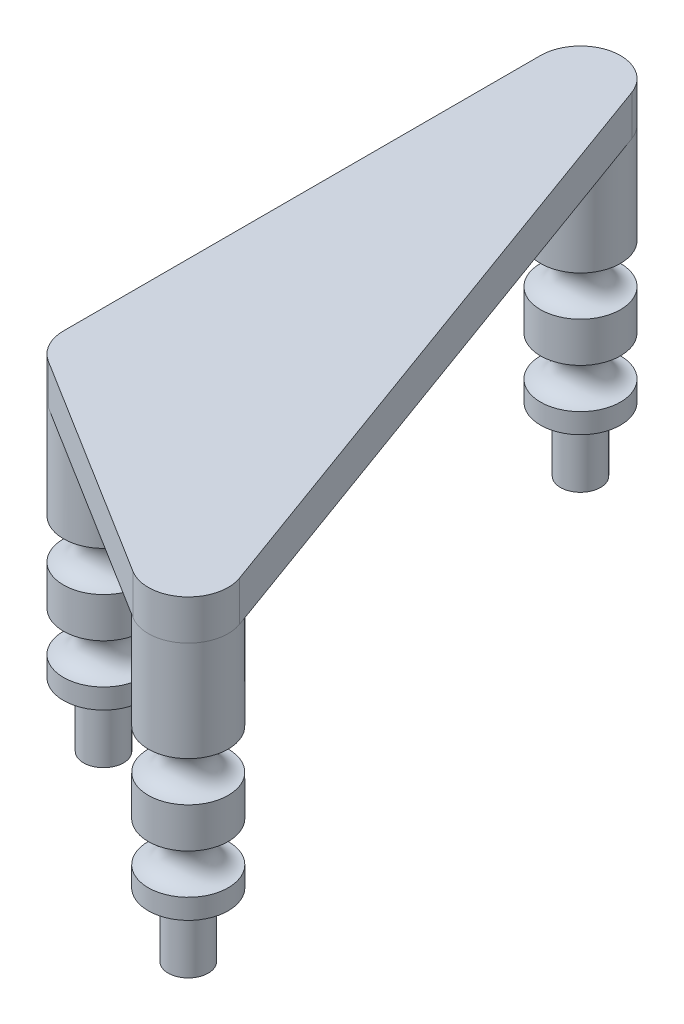
ISO-10303-21;
HEADER;
FILE_DESCRIPTION(('STEP AP214'),'2;1');
FILE_NAME('part.step','',(''),(''),'','','');
FILE_SCHEMA(('AUTOMOTIVE_DESIGN { 1 0 10303 214 1 1 1 1 }'));
ENDSEC;
DATA;
#1=APPLICATION_CONTEXT('core data for automotive mechanical design processes');
#2=APPLICATION_PROTOCOL_DEFINITION('international standard','automotive_design',2000,#1);
#3=PRODUCT_CONTEXT('',#1,'mechanical');
#4=PRODUCT('Part','Part','',(#3));
#5=PRODUCT_RELATED_PRODUCT_CATEGORY('part','',(#4));
#6=PRODUCT_DEFINITION_FORMATION('','',#4);
#7=PRODUCT_DEFINITION_CONTEXT('part definition',#1,'design');
#8=PRODUCT_DEFINITION('design','',#6,#7);
#9=PRODUCT_DEFINITION_SHAPE('','',#8);
#10=(LENGTH_UNIT() NAMED_UNIT(*) SI_UNIT(.MILLI.,.METRE.));
#11=(NAMED_UNIT(*) PLANE_ANGLE_UNIT() SI_UNIT($,.RADIAN.));
#12=(NAMED_UNIT(*) SI_UNIT($,.STERADIAN.) SOLID_ANGLE_UNIT());
#13=UNCERTAINTY_MEASURE_WITH_UNIT(LENGTH_MEASURE(1.E-05),#10,'distance_accuracy_value','');
#14=(GEOMETRIC_REPRESENTATION_CONTEXT(3) GLOBAL_UNCERTAINTY_ASSIGNED_CONTEXT((#13)) GLOBAL_UNIT_ASSIGNED_CONTEXT((#10,
#11,#12)) REPRESENTATION_CONTEXT('',''));
#15=CARTESIAN_POINT('',(0.,0.,0.));
#16=DIRECTION('',(0.,0.,1.));
#17=DIRECTION('',(1.,0.,0.));
#18=AXIS2_PLACEMENT_3D('',#15,#16,#17);
#19=CARTESIAN_POINT('',(0.,-38.1,-75.68438));
#20=DIRECTION('',(0.,1.,0.));
#21=DIRECTION('',(0.,0.,1.));
#22=AXIS2_PLACEMENT_3D('',#19,#20,#21);
#23=CYLINDRICAL_SURFACE('',#22,6.35);
#24=CARTESIAN_POINT('',(0.,0.,-75.68438));
#25=DIRECTION('',(0.,1.,0.));
#26=DIRECTION('',(0.,0.,1.));
#27=AXIS2_PLACEMENT_3D('',#24,#25,#26);
#28=CIRCLE('',#27,6.35);
#29=CARTESIAN_POINT('',(5.96704814199053,0.,-77.856207910118));
#30=VERTEX_POINT('',#29);
#31=CARTESIAN_POINT('',(-6.35,0.,-75.68438));
#32=VERTEX_POINT('',#31);
#33=EDGE_CURVE('E360',#30,#32,#28,.T.);
#34=ORIENTED_EDGE('',*,*,#33,.F.);
#35=EDGE_CURVE('E247',#32,#30,#28,.T.);
#36=ORIENTED_EDGE('',*,*,#35,.F.);
#37=EDGE_LOOP('',(#34,#36));
#38=FACE_BOUND('',#37,.T.);
#39=CARTESIAN_POINT('',(0.,-15.875,-75.68438));
#40=DIRECTION('',(0.,-1.,0.));
#41=DIRECTION('',(0.,0.,-1.));
#42=AXIS2_PLACEMENT_3D('',#39,#40,#41);
#43=CIRCLE('',#42,6.35);
#44=CARTESIAN_POINT('',(0.,-15.875,-82.03438));
#45=VERTEX_POINT('',#44);
#46=EDGE_CURVE('E304',#45,#45,#43,.F.);
#47=ORIENTED_EDGE('',*,*,#46,.T.);
#48=EDGE_LOOP('',(#47));
#49=FACE_BOUND('',#48,.T.);
#50=ADVANCED_FACE('F181',(#38,#49),#23,.T.);
#51=CARTESIAN_POINT('',(0.,6.35,0.));
#52=DIRECTION('',(0.,-1.,0.));
#53=DIRECTION('',(0.,0.,-1.));
#54=AXIS2_PLACEMENT_3D('',#51,#52,#53);
#55=CYLINDRICAL_SURFACE('',#54,6.35);
#56=CARTESIAN_POINT('',(0.,6.35,0.));
#57=DIRECTION('',(0.,1.,0.));
#58=DIRECTION('',(0.,0.,1.));
#59=AXIS2_PLACEMENT_3D('',#56,#57,#58);
#60=CIRCLE('',#59,6.35);
#61=CARTESIAN_POINT('',(-6.35,6.35,0.));
#62=VERTEX_POINT('',#61);
#63=CARTESIAN_POINT('',(-3.35600824597808,6.35,5.39070576575342));
#64=VERTEX_POINT('',#63);
#65=EDGE_CURVE('E359',#62,#64,#60,.T.);
#66=ORIENTED_EDGE('',*,*,#65,.F.);
#67=DIRECTION('',(0.,-1.,0.));
#68=VECTOR('',#67,1.);
#69=CARTESIAN_POINT('',(-6.35,6.35,0.));
#70=LINE('',#69,#68);
#71=CARTESIAN_POINT('',(-6.35,0.,0.));
#72=VERTEX_POINT('',#71);
#73=EDGE_CURVE('E379',#62,#72,#70,.T.);
#74=ORIENTED_EDGE('',*,*,#73,.T.);
#75=CARTESIAN_POINT('',(0.,0.,0.));
#76=DIRECTION('',(0.,1.,0.));
#77=DIRECTION('',(0.,0.,1.));
#78=AXIS2_PLACEMENT_3D('',#75,#76,#77);
#79=CIRCLE('',#78,6.35);
#80=CARTESIAN_POINT('',(-3.35600824597808,0.,5.39070576575342));
#81=VERTEX_POINT('',#80);
#82=EDGE_CURVE('E364',#81,#72,#79,.T.);
#83=ORIENTED_EDGE('',*,*,#82,.F.);
#84=DIRECTION('',(0.,-1.,0.));
#85=VECTOR('',#84,1.);
#86=CARTESIAN_POINT('',(-3.35600824597808,6.35,5.39070576575342));
#87=LINE('',#86,#85);
#88=EDGE_CURVE('E262',#64,#81,#87,.T.);
#89=ORIENTED_EDGE('',*,*,#88,.F.);
#90=EDGE_LOOP('',(#66,#74,#83,#89));
#91=FACE_BOUND('',#90,.T.);
#92=CARTESIAN_POINT('',(0.,-15.875,0.));
#93=DIRECTION('',(0.,-1.,0.));
#94=DIRECTION('',(0.,0.,-1.));
#95=AXIS2_PLACEMENT_3D('',#92,#93,#94);
#96=CIRCLE('',#95,6.35);
#97=CARTESIAN_POINT('',(0.,-15.875,-6.35));
#98=VERTEX_POINT('',#97);
#99=EDGE_CURVE('E296',#98,#98,#96,.T.);
#100=ORIENTED_EDGE('',*,*,#99,.F.);
#101=EDGE_LOOP('',(#100));
#102=FACE_BOUND('',#101,.T.);
#103=ADVANCED_FACE('F336',(#91,#102),#55,.T.);
#104=CARTESIAN_POINT('',(35.617471135486,-38.1,22.1738176828264));
#105=DIRECTION('',(0.,1.,0.));
#106=DIRECTION('',(0.,0.,1.));
#107=AXIS2_PLACEMENT_3D('',#104,#105,#106);
#108=CYLINDRICAL_SURFACE('',#107,6.35);
#109=CARTESIAN_POINT('',(35.617471135486,0.,22.1738176828264));
#110=DIRECTION('',(0.,1.,0.));
#111=DIRECTION('',(0.,0.,1.));
#112=AXIS2_PLACEMENT_3D('',#109,#110,#111);
#113=CIRCLE('',#112,6.35);
#114=CARTESIAN_POINT('',(41.5845192774765,0.,20.0019897727084));
#115=VERTEX_POINT('',#114);
#116=CARTESIAN_POINT('',(32.2614628895079,0.,27.5645234485798));
#117=VERTEX_POINT('',#116);
#118=EDGE_CURVE('E241',#115,#117,#113,.T.);
#119=ORIENTED_EDGE('',*,*,#118,.F.);
#120=CARTESIAN_POINT('',(35.617471135486,0.,22.1738176828264));
#121=DIRECTION('',(0.,1.,0.));
#122=DIRECTION('',(0.,0.,1.));
#123=AXIS2_PLACEMENT_3D('',#120,#121,#122);
#124=CIRCLE('',#123,6.35);
#125=EDGE_CURVE('E237',#117,#115,#124,.T.);
#126=ORIENTED_EDGE('',*,*,#125,.F.);
#127=EDGE_LOOP('',(#119,#126));
#128=FACE_BOUND('',#127,.T.);
#129=CARTESIAN_POINT('',(35.617471135486,-15.875,22.1738176828264));
#130=DIRECTION('',(0.,-1.,0.));
#131=DIRECTION('',(0.,0.,-1.));
#132=AXIS2_PLACEMENT_3D('',#129,#130,#131);
#133=CIRCLE('',#132,6.35);
#134=CARTESIAN_POINT('',(35.617471135486,-15.875,15.8238176828264));
#135=VERTEX_POINT('',#134);
#136=EDGE_CURVE('E279',#135,#135,#133,.F.);
#137=ORIENTED_EDGE('',*,*,#136,.T.);
#138=EDGE_LOOP('',(#137));
#139=FACE_BOUND('',#138,.T.);
#140=ADVANCED_FACE('F239',(#128,#139),#108,.T.);
#141=CARTESIAN_POINT('',(0.,0.,0.));
#142=DIRECTION('',(0.,1.,0.));
#143=DIRECTION('',(0.,0.,1.));
#144=AXIS2_PLACEMENT_3D('',#141,#142,#143);
#145=PLANE('',#144);
#146=DIRECTION('',(0.342020143325663,0.,0.939692620785911));
#147=VECTOR('',#146,1.);
#148=CARTESIAN_POINT('',(30.291538997394,0.,-11.0252185451651));
#149=LINE('',#148,#147);
#150=EDGE_CURVE('E255',#30,#115,#149,.T.);
#151=ORIENTED_EDGE('',*,*,#150,.T.);
#152=ORIENTED_EDGE('',*,*,#118,.T.);
#153=DIRECTION('',(-0.848930041850932,0.,-0.528505235587099));
#154=VECTOR('',#153,1.);
#155=CARTESIAN_POINT('',(-3.35600824597808,0.,5.39070576575342));
#156=LINE('',#155,#154);
#157=EDGE_CURVE('E251',#117,#81,#156,.T.);
#158=ORIENTED_EDGE('',*,*,#157,.T.);
#159=ORIENTED_EDGE('',*,*,#82,.T.);
#160=DIRECTION('',(0.,0.,-1.));
#161=VECTOR('',#160,1.);
#162=CARTESIAN_POINT('',(-6.35,0.,0.));
#163=LINE('',#162,#161);
#164=EDGE_CURVE('E376',#72,#32,#163,.T.);
#165=ORIENTED_EDGE('',*,*,#164,.T.);
#166=ORIENTED_EDGE('',*,*,#35,.T.);
#167=EDGE_LOOP('',(#151,#152,#158,#159,#165,#166));
#168=FACE_BOUND('',#167,.T.);
#169=ADVANCED_FACE('F250',(#168),#145,.F.);
#170=CARTESIAN_POINT('',(-3.35600824597808,6.35,5.39070576575342));
#171=DIRECTION('',(-0.528505235587099,0.,0.848930041850932));
#172=DIRECTION('',(0.848930041850932,0.,0.528505235587099));
#173=AXIS2_PLACEMENT_3D('',#170,#171,#172);
#174=PLANE('',#173);
#175=ORIENTED_EDGE('',*,*,#157,.F.);
#176=DIRECTION('',(0.,-1.,0.));
#177=VECTOR('',#176,1.);
#178=CARTESIAN_POINT('',(32.2614628895079,6.35,27.5645234485798));
#179=LINE('',#178,#177);
#180=CARTESIAN_POINT('',(32.2614628895079,6.35,27.5645234485798));
#181=VERTEX_POINT('',#180);
#182=EDGE_CURVE('E206',#117,#181,#179,.F.);
#183=ORIENTED_EDGE('',*,*,#182,.T.);
#184=DIRECTION('',(-0.848930041850932,0.,-0.528505235587099));
#185=VECTOR('',#184,1.);
#186=CARTESIAN_POINT('',(-3.35600824597808,6.35,5.39070576575342));
#187=LINE('',#186,#185);
#188=EDGE_CURVE('E369',#181,#64,#187,.T.);
#189=ORIENTED_EDGE('',*,*,#188,.T.);
#190=ORIENTED_EDGE('',*,*,#88,.T.);
#191=EDGE_LOOP('',(#175,#183,#189,#190));
#192=FACE_BOUND('',#191,.T.);
#193=ADVANCED_FACE('F260',(#192),#174,.T.);
#194=CARTESIAN_POINT('',(30.291538997394,6.35,-11.0252185451651));
#195=DIRECTION('',(0.93969262078591,0.,-0.342020143325663));
#196=DIRECTION('',(-0.342020143325663,0.,-0.939692620785911));
#197=AXIS2_PLACEMENT_3D('',#194,#195,#196);
#198=PLANE('',#197);
#199=DIRECTION('',(0.342020143325663,0.,0.939692620785911));
#200=VECTOR('',#199,1.);
#201=CARTESIAN_POINT('',(30.291538997394,6.35,-11.0252185451651));
#202=LINE('',#201,#200);
#203=CARTESIAN_POINT('',(5.96704814199053,6.35,-77.856207910118));
#204=VERTEX_POINT('',#203);
#205=CARTESIAN_POINT('',(41.5845192774765,6.35,20.0019897727084));
#206=VERTEX_POINT('',#205);
#207=EDGE_CURVE('E371',#204,#206,#202,.T.);
#208=ORIENTED_EDGE('',*,*,#207,.T.);
#209=DIRECTION('',(0.,-1.,0.));
#210=VECTOR('',#209,1.);
#211=CARTESIAN_POINT('',(41.5845192774765,6.35,20.0019897727084));
#212=LINE('',#211,#210);
#213=EDGE_CURVE('E268',#206,#115,#212,.T.);
#214=ORIENTED_EDGE('',*,*,#213,.T.);
#215=ORIENTED_EDGE('',*,*,#150,.F.);
#216=DIRECTION('',(0.,-1.,0.));
#217=VECTOR('',#216,1.);
#218=CARTESIAN_POINT('',(5.96704814199053,6.35,-77.856207910118));
#219=LINE('',#218,#217);
#220=EDGE_CURVE('E246',#30,#204,#219,.F.);
#221=ORIENTED_EDGE('',*,*,#220,.T.);
#222=EDGE_LOOP('',(#208,#214,#215,#221));
#223=FACE_BOUND('',#222,.T.);
#224=ADVANCED_FACE('F384',(#223),#198,.T.);
#225=CARTESIAN_POINT('',(0.,6.35,0.));
#226=DIRECTION('',(0.,1.,0.));
#227=DIRECTION('',(0.,0.,1.));
#228=AXIS2_PLACEMENT_3D('',#225,#226,#227);
#229=PLANE('',#228);
#230=ORIENTED_EDGE('',*,*,#188,.F.);
#231=CARTESIAN_POINT('',(35.617471135486,6.35,22.1738176828264));
#232=DIRECTION('',(0.,1.,0.));
#233=DIRECTION('',(0.,0.,1.));
#234=AXIS2_PLACEMENT_3D('',#231,#232,#233);
#235=CIRCLE('',#234,6.35);
#236=EDGE_CURVE('E267',#181,#206,#235,.T.);
#237=ORIENTED_EDGE('',*,*,#236,.T.);
#238=ORIENTED_EDGE('',*,*,#207,.F.);
#239=CARTESIAN_POINT('',(0.,6.35,-75.68438));
#240=DIRECTION('',(0.,1.,0.));
#241=DIRECTION('',(0.,0.,1.));
#242=AXIS2_PLACEMENT_3D('',#239,#240,#241);
#243=CIRCLE('',#242,6.35);
#244=CARTESIAN_POINT('',(-6.35,6.35,-75.68438));
#245=VERTEX_POINT('',#244);
#246=EDGE_CURVE('E198',#204,#245,#243,.T.);
#247=ORIENTED_EDGE('',*,*,#246,.T.);
#248=DIRECTION('',(0.,0.,-1.));
#249=VECTOR('',#248,1.);
#250=CARTESIAN_POINT('',(-6.35,6.35,0.));
#251=LINE('',#250,#249);
#252=EDGE_CURVE('E263',#62,#245,#251,.T.);
#253=ORIENTED_EDGE('',*,*,#252,.F.);
#254=ORIENTED_EDGE('',*,*,#65,.T.);
#255=EDGE_LOOP('',(#230,#237,#238,#247,#253,#254));
#256=FACE_BOUND('',#255,.T.);
#257=ADVANCED_FACE('F386',(#256),#229,.T.);
#258=CARTESIAN_POINT('',(-6.35,6.35,0.));
#259=DIRECTION('',(-1.,0.,0.));
#260=DIRECTION('',(0.,0.,1.));
#261=AXIS2_PLACEMENT_3D('',#258,#259,#260);
#262=PLANE('',#261);
#263=ORIENTED_EDGE('',*,*,#252,.T.);
#264=DIRECTION('',(0.,-1.,0.));
#265=VECTOR('',#264,1.);
#266=CARTESIAN_POINT('',(-6.35,6.35,-75.68438));
#267=LINE('',#266,#265);
#268=EDGE_CURVE('E275',#245,#32,#267,.T.);
#269=ORIENTED_EDGE('',*,*,#268,.T.);
#270=ORIENTED_EDGE('',*,*,#164,.F.);
#271=ORIENTED_EDGE('',*,*,#73,.F.);
#272=EDGE_LOOP('',(#263,#269,#270,#271));
#273=FACE_BOUND('',#272,.T.);
#274=ADVANCED_FACE('F391',(#273),#262,.T.);
#275=CARTESIAN_POINT('',(35.617471135486,6.35,22.1738176828264));
#276=DIRECTION('',(0.,-1.,0.));
#277=DIRECTION('',(0.,0.,-1.));
#278=AXIS2_PLACEMENT_3D('',#275,#276,#277);
#279=CYLINDRICAL_SURFACE('',#278,6.35);
#280=ORIENTED_EDGE('',*,*,#236,.F.);
#281=ORIENTED_EDGE('',*,*,#182,.F.);
#282=ORIENTED_EDGE('',*,*,#125,.T.);
#283=ORIENTED_EDGE('',*,*,#213,.F.);
#284=EDGE_LOOP('',(#280,#281,#282,#283));
#285=FACE_BOUND('',#284,.T.);
#286=ADVANCED_FACE('F266',(#285),#279,.T.);
#287=CARTESIAN_POINT('',(0.,6.35,-75.68438));
#288=DIRECTION('',(0.,-1.,0.));
#289=DIRECTION('',(0.,0.,-1.));
#290=AXIS2_PLACEMENT_3D('',#287,#288,#289);
#291=CYLINDRICAL_SURFACE('',#290,6.35);
#292=ORIENTED_EDGE('',*,*,#246,.F.);
#293=ORIENTED_EDGE('',*,*,#220,.F.);
#294=ORIENTED_EDGE('',*,*,#33,.T.);
#295=ORIENTED_EDGE('',*,*,#268,.F.);
#296=EDGE_LOOP('',(#292,#293,#294,#295));
#297=FACE_BOUND('',#296,.T.);
#298=ADVANCED_FACE('F183',(#297),#291,.T.);
#299=CARTESIAN_POINT('',(35.617471135486,-19.05,22.1738176828264));
#300=DIRECTION('',(0.,-1.,0.));
#301=DIRECTION('',(0.,0.,-1.));
#302=AXIS2_PLACEMENT_3D('',#299,#300,#301);
#303=TOROIDAL_SURFACE('',#302,6.35,3.175);
#304=CARTESIAN_POINT('',(35.617471135486,-22.225,22.1738176828264));
#305=DIRECTION('',(0.,1.,0.));
#306=DIRECTION('',(0.,0.,1.));
#307=AXIS2_PLACEMENT_3D('',#304,#305,#306);
#308=CIRCLE('',#307,6.35);
#309=CARTESIAN_POINT('',(35.617471135486,-22.225,28.5238176828264));
#310=VERTEX_POINT('',#309);
#311=EDGE_CURVE('E282',#310,#310,#308,.F.);
#312=ORIENTED_EDGE('',*,*,#311,.F.);
#313=EDGE_LOOP('',(#312));
#314=FACE_BOUND('',#313,.T.);
#315=ORIENTED_EDGE('',*,*,#136,.F.);
#316=EDGE_LOOP('',(#315));
#317=FACE_BOUND('',#316,.T.);
#318=ADVANCED_FACE('F479',(#314,#317),#303,.F.);
#319=CARTESIAN_POINT('',(35.617471135486,-28.575,22.1738176828264));
#320=DIRECTION('',(0.,-1.,0.));
#321=DIRECTION('',(0.,0.,-1.));
#322=AXIS2_PLACEMENT_3D('',#319,#320,#321);
#323=CIRCLE('',#322,6.35);
#324=CARTESIAN_POINT('',(35.617471135486,-28.575,28.5238176828264));
#325=VERTEX_POINT('',#324);
#326=EDGE_CURVE('E286',#325,#325,#323,.F.);
#327=CARTESIAN_POINT('',(35.617471135486,-22.225,28.5238176828264));
#328=CARTESIAN_POINT('',(35.617471135486,-22.2911458333333,28.5238176828264));
#329=CARTESIAN_POINT('',(35.617471135486,-22.3572916666667,28.5238176828264));
#330=CARTESIAN_POINT('',(35.617471135486,-22.4895833333333,28.5238176828264));
#331=CARTESIAN_POINT('',(35.617471135486,-22.5557291666667,28.5238176828264));
#332=CARTESIAN_POINT('',(35.617471135486,-22.6880208333333,28.5238176828264));
#333=CARTESIAN_POINT('',(35.617471135486,-22.7541666666667,28.5238176828264));
#334=CARTESIAN_POINT('',(35.617471135486,-22.8864583333333,28.5238176828264));
#335=CARTESIAN_POINT('',(35.617471135486,-22.9526041666667,28.5238176828264));
#336=CARTESIAN_POINT('',(35.617471135486,-23.0848958333333,28.5238176828264));
#337=CARTESIAN_POINT('',(35.617471135486,-23.1510416666667,28.5238176828264));
#338=CARTESIAN_POINT('',(35.617471135486,-23.2833333333333,28.5238176828264));
#339=CARTESIAN_POINT('',(35.617471135486,-23.3494791666667,28.5238176828264));
#340=CARTESIAN_POINT('',(35.617471135486,-23.4817708333333,28.5238176828264));
#341=CARTESIAN_POINT('',(35.617471135486,-23.5479166666667,28.5238176828264));
#342=CARTESIAN_POINT('',(35.617471135486,-23.6802083333333,28.5238176828264));
#343=CARTESIAN_POINT('',(35.617471135486,-23.7463541666667,28.5238176828264));
#344=CARTESIAN_POINT('',(35.617471135486,-23.8786458333333,28.5238176828264));
#345=CARTESIAN_POINT('',(35.617471135486,-23.9447916666667,28.5238176828264));
#346=CARTESIAN_POINT('',(35.617471135486,-24.0770833333333,28.5238176828264));
#347=CARTESIAN_POINT('',(35.617471135486,-24.1432291666667,28.5238176828264));
#348=CARTESIAN_POINT('',(35.617471135486,-24.2755208333333,28.5238176828264));
#349=CARTESIAN_POINT('',(35.617471135486,-24.3416666666667,28.5238176828264));
#350=CARTESIAN_POINT('',(35.617471135486,-24.4739583333333,28.5238176828264));
#351=CARTESIAN_POINT('',(35.617471135486,-24.5401041666667,28.5238176828264));
#352=CARTESIAN_POINT('',(35.617471135486,-24.6723958333333,28.5238176828264));
#353=CARTESIAN_POINT('',(35.617471135486,-24.7385416666667,28.5238176828264));
#354=CARTESIAN_POINT('',(35.617471135486,-24.8708333333333,28.5238176828264));
#355=CARTESIAN_POINT('',(35.617471135486,-24.9369791666667,28.5238176828264));
#356=CARTESIAN_POINT('',(35.617471135486,-25.0692708333333,28.5238176828264));
#357=CARTESIAN_POINT('',(35.617471135486,-25.1354166666667,28.5238176828264));
#358=CARTESIAN_POINT('',(35.617471135486,-25.2677083333333,28.5238176828264));
#359=CARTESIAN_POINT('',(35.617471135486,-25.3338541666667,28.5238176828264));
#360=CARTESIAN_POINT('',(35.617471135486,-25.4661458333333,28.5238176828264));
#361=CARTESIAN_POINT('',(35.617471135486,-25.5322916666667,28.5238176828264));
#362=CARTESIAN_POINT('',(35.617471135486,-25.6645833333333,28.5238176828264));
#363=CARTESIAN_POINT('',(35.617471135486,-25.7307291666667,28.5238176828264));
#364=CARTESIAN_POINT('',(35.617471135486,-25.8630208333333,28.5238176828264));
#365=CARTESIAN_POINT('',(35.617471135486,-25.9291666666667,28.5238176828264));
#366=CARTESIAN_POINT('',(35.617471135486,-26.0614583333333,28.5238176828264));
#367=CARTESIAN_POINT('',(35.617471135486,-26.1276041666667,28.5238176828264));
#368=CARTESIAN_POINT('',(35.617471135486,-26.2598958333333,28.5238176828264));
#369=CARTESIAN_POINT('',(35.617471135486,-26.3260416666667,28.5238176828264));
#370=CARTESIAN_POINT('',(35.617471135486,-26.4583333333333,28.5238176828264));
#371=CARTESIAN_POINT('',(35.617471135486,-26.5244791666667,28.5238176828264));
#372=CARTESIAN_POINT('',(35.617471135486,-26.6567708333333,28.5238176828264));
#373=CARTESIAN_POINT('',(35.617471135486,-26.7229166666667,28.5238176828264));
#374=CARTESIAN_POINT('',(35.617471135486,-26.8552083333333,28.5238176828264));
#375=CARTESIAN_POINT('',(35.617471135486,-26.9213541666667,28.5238176828264));
#376=CARTESIAN_POINT('',(35.617471135486,-27.0536458333333,28.5238176828264));
#377=CARTESIAN_POINT('',(35.617471135486,-27.1197916666667,28.5238176828264));
#378=CARTESIAN_POINT('',(35.617471135486,-27.2520833333333,28.5238176828264));
#379=CARTESIAN_POINT('',(35.617471135486,-27.3182291666667,28.5238176828264));
#380=CARTESIAN_POINT('',(35.617471135486,-27.4505208333333,28.5238176828264));
#381=CARTESIAN_POINT('',(35.617471135486,-27.5166666666667,28.5238176828264));
#382=CARTESIAN_POINT('',(35.617471135486,-27.6489583333333,28.5238176828264));
#383=CARTESIAN_POINT('',(35.617471135486,-27.7151041666667,28.5238176828264));
#384=CARTESIAN_POINT('',(35.617471135486,-27.8473958333333,28.5238176828264));
#385=CARTESIAN_POINT('',(35.617471135486,-27.9135416666667,28.5238176828264));
#386=CARTESIAN_POINT('',(35.617471135486,-28.0458333333333,28.5238176828264));
#387=CARTESIAN_POINT('',(35.617471135486,-28.1119791666667,28.5238176828264));
#388=CARTESIAN_POINT('',(35.617471135486,-28.2442708333333,28.5238176828264));
#389=CARTESIAN_POINT('',(35.617471135486,-28.3104166666667,28.5238176828264));
#390=CARTESIAN_POINT('',(35.617471135486,-28.4427083333333,28.5238176828264));
#391=CARTESIAN_POINT('',(35.617471135486,-28.5088541666667,28.5238176828264));
#392=CARTESIAN_POINT('',(35.617471135486,-28.575,28.5238176828264));
#393=B_SPLINE_CURVE_WITH_KNOTS('',3,(#327,#328,#329,#330,#331,#332,#333,#334,#335,#336,#337,
#338,#339,#340,#341,#342,#343,#344,#345,#346,#347,#348,#349,#350,#351,#352,#353,#354,#355,#356,
#357,#358,#359,#360,#361,#362,#363,#364,#365,#366,#367,#368,#369,#370,#371,#372,#373,#374,#375,
#376,#377,#378,#379,#380,#381,#382,#383,#384,#385,#386,#387,#388,#389,#390,#391,#392),
.UNSPECIFIED.,.F.,.F.,(4,2,2,2,2,2,2,2,2,2,2,2,2,2,2,2,2,2,2,2,2,2,2,2,2,2,2,2,2,2,2,2,4),(0.,
0.198437499999999,0.396874999999998,0.595312499999997,0.793749999999999,0.992187499999995,
1.190625,1.3890625,1.5875,1.7859375,1.984375,2.1828125,2.38125,2.57968749999999,2.778125,
2.9765625,3.17499999999999,3.3734375,3.571875,3.77031249999999,3.96875,4.16718749999999,
4.36562499999999,4.5640625,4.76249999999999,4.96093749999999,5.15937499999999,5.35781249999999,
5.55625,5.75468749999999,5.95312499999999,6.1515625,6.34999999999999),.UNSPECIFIED.);
#394=EDGE_CURVE('BSEAM443',#310,#325,#393,.T.);
#395=ORIENTED_EDGE('',*,*,#311,.T.);
#396=ORIENTED_EDGE('',*,*,#326,.T.);
#397=ORIENTED_EDGE('',*,*,#394,.T.);
#398=ORIENTED_EDGE('',*,*,#394,.F.);
#399=EDGE_LOOP('',(#395,#397,#396,#398));
#400=FACE_BOUND('',#399,.T.);
#401=ADVANCED_FACE('F443',(#400),#108,.T.);
#402=CARTESIAN_POINT('',(35.617471135486,-31.75,22.1738176828264));
#403=DIRECTION('',(0.,-1.,0.));
#404=DIRECTION('',(0.,0.,-1.));
#405=AXIS2_PLACEMENT_3D('',#402,#403,#404);
#406=TOROIDAL_SURFACE('',#405,6.35,3.175);
#407=CARTESIAN_POINT('',(35.617471135486,-34.925,22.1738176828264));
#408=DIRECTION('',(0.,1.,0.));
#409=DIRECTION('',(0.,0.,1.));
#410=AXIS2_PLACEMENT_3D('',#407,#408,#409);
#411=CIRCLE('',#410,6.35);
#412=CARTESIAN_POINT('',(35.617471135486,-34.925,28.5238176828264));
#413=VERTEX_POINT('',#412);
#414=EDGE_CURVE('E289',#413,#413,#411,.F.);
#415=ORIENTED_EDGE('',*,*,#414,.F.);
#416=EDGE_LOOP('',(#415));
#417=FACE_BOUND('',#416,.T.);
#418=ORIENTED_EDGE('',*,*,#326,.F.);
#419=EDGE_LOOP('',(#418));
#420=FACE_BOUND('',#419,.T.);
#421=ADVANCED_FACE('F422',(#417,#420),#406,.F.);
#422=CARTESIAN_POINT('',(35.617471135486,-48.26,22.1738176828264));
#423=DIRECTION('',(0.,-1.,0.));
#424=DIRECTION('',(0.,0.,-1.));
#425=AXIS2_PLACEMENT_3D('',#422,#423,#424);
#426=PLANE('',#425);
#427=CARTESIAN_POINT('',(35.617471135486,-48.26,22.1738176828264));
#428=DIRECTION('',(0.,-1.,0.));
#429=DIRECTION('',(0.,0.,-1.));
#430=AXIS2_PLACEMENT_3D('',#427,#428,#429);
#431=CIRCLE('',#430,3.175);
#432=CARTESIAN_POINT('',(35.617471135486,-48.26,18.9988176828264));
#433=VERTEX_POINT('',#432);
#434=EDGE_CURVE('E402',#433,#433,#431,.T.);
#435=ORIENTED_EDGE('',*,*,#434,.T.);
#436=EDGE_LOOP('',(#435));
#437=FACE_BOUND('',#436,.T.);
#438=ADVANCED_FACE('F418',(#437),#426,.T.);
#439=CARTESIAN_POINT('',(35.617471135486,-48.26,22.1738176828264));
#440=DIRECTION('',(0.,1.,0.));
#441=DIRECTION('',(0.,0.,1.));
#442=AXIS2_PLACEMENT_3D('',#439,#440,#441);
#443=CYLINDRICAL_SURFACE('',#442,3.175);
#444=ORIENTED_EDGE('',*,*,#434,.F.);
#445=EDGE_LOOP('',(#444));
#446=FACE_BOUND('',#445,.T.);
#447=CARTESIAN_POINT('',(35.617471135486,-38.1,22.1738176828264));
#448=DIRECTION('',(0.,-1.,0.));
#449=DIRECTION('',(0.,0.,-1.));
#450=AXIS2_PLACEMENT_3D('',#447,#448,#449);
#451=CIRCLE('',#450,3.175);
#452=CARTESIAN_POINT('',(35.617471135486,-38.1,18.9988176828264));
#453=VERTEX_POINT('',#452);
#454=EDGE_CURVE('E190',#453,#453,#451,.T.);
#455=ORIENTED_EDGE('',*,*,#454,.T.);
#456=EDGE_LOOP('',(#455));
#457=FACE_BOUND('',#456,.T.);
#458=ADVANCED_FACE('F421',(#446,#457),#443,.T.);
#459=CARTESIAN_POINT('',(35.617471135486,-38.1,22.1738176828264));
#460=DIRECTION('',(0.,1.,0.));
#461=DIRECTION('',(0.,0.,1.));
#462=AXIS2_PLACEMENT_3D('',#459,#460,#461);
#463=PLANE('',#462);
#464=ORIENTED_EDGE('',*,*,#454,.F.);
#465=EDGE_LOOP('',(#464));
#466=FACE_BOUND('',#465,.T.);
#467=CARTESIAN_POINT('',(35.617471135486,-38.1,22.1738176828264));
#468=DIRECTION('',(0.,1.,0.));
#469=DIRECTION('',(0.,0.,1.));
#470=AXIS2_PLACEMENT_3D('',#467,#468,#469);
#471=CIRCLE('',#470,6.35);
#472=CARTESIAN_POINT('',(35.617471135486,-38.1,28.5238176828264));
#473=VERTEX_POINT('',#472);
#474=EDGE_CURVE('E257',#473,#473,#471,.T.);
#475=ORIENTED_EDGE('',*,*,#474,.F.);
#476=EDGE_LOOP('',(#475));
#477=FACE_BOUND('',#476,.T.);
#478=ADVANCED_FACE('F426',(#466,#477),#463,.F.);
#479=CARTESIAN_POINT('',(35.617471135486,-38.1,28.5238176828264));
#480=CARTESIAN_POINT('',(35.617471135486,-38.0669270833333,28.5238176828264));
#481=CARTESIAN_POINT('',(35.617471135486,-38.0338541666667,28.5238176828264));
#482=CARTESIAN_POINT('',(35.617471135486,-37.9677083333333,28.5238176828264));
#483=CARTESIAN_POINT('',(35.617471135486,-37.9346354166667,28.5238176828264));
#484=CARTESIAN_POINT('',(35.617471135486,-37.8684895833333,28.5238176828264));
#485=CARTESIAN_POINT('',(35.617471135486,-37.8354166666667,28.5238176828264));
#486=CARTESIAN_POINT('',(35.617471135486,-37.7692708333333,28.5238176828264));
#487=CARTESIAN_POINT('',(35.617471135486,-37.7361979166667,28.5238176828264));
#488=CARTESIAN_POINT('',(35.617471135486,-37.6700520833333,28.5238176828264));
#489=CARTESIAN_POINT('',(35.617471135486,-37.6369791666667,28.5238176828264));
#490=CARTESIAN_POINT('',(35.617471135486,-37.5708333333333,28.5238176828264));
#491=CARTESIAN_POINT('',(35.617471135486,-37.5377604166667,28.5238176828264));
#492=CARTESIAN_POINT('',(35.617471135486,-37.4716145833333,28.5238176828264));
#493=CARTESIAN_POINT('',(35.617471135486,-37.4385416666667,28.5238176828264));
#494=CARTESIAN_POINT('',(35.617471135486,-37.3723958333333,28.5238176828264));
#495=CARTESIAN_POINT('',(35.617471135486,-37.3393229166667,28.5238176828264));
#496=CARTESIAN_POINT('',(35.617471135486,-37.2731770833333,28.5238176828264));
#497=CARTESIAN_POINT('',(35.617471135486,-37.2401041666667,28.5238176828264));
#498=CARTESIAN_POINT('',(35.617471135486,-37.1739583333333,28.5238176828264));
#499=CARTESIAN_POINT('',(35.617471135486,-37.1408854166667,28.5238176828264));
#500=CARTESIAN_POINT('',(35.617471135486,-37.0747395833333,28.5238176828264));
#501=CARTESIAN_POINT('',(35.617471135486,-37.0416666666667,28.5238176828264));
#502=CARTESIAN_POINT('',(35.617471135486,-36.9755208333333,28.5238176828264));
#503=CARTESIAN_POINT('',(35.617471135486,-36.9424479166667,28.5238176828264));
#504=CARTESIAN_POINT('',(35.617471135486,-36.8763020833333,28.5238176828264));
#505=CARTESIAN_POINT('',(35.617471135486,-36.8432291666667,28.5238176828264));
#506=CARTESIAN_POINT('',(35.617471135486,-36.7770833333333,28.5238176828264));
#507=CARTESIAN_POINT('',(35.617471135486,-36.7440104166667,28.5238176828264));
#508=CARTESIAN_POINT('',(35.617471135486,-36.6778645833333,28.5238176828264));
#509=CARTESIAN_POINT('',(35.617471135486,-36.6447916666667,28.5238176828264));
#510=CARTESIAN_POINT('',(35.617471135486,-36.5786458333333,28.5238176828264));
#511=CARTESIAN_POINT('',(35.617471135486,-36.5455729166667,28.5238176828264));
#512=CARTESIAN_POINT('',(35.617471135486,-36.4794270833333,28.5238176828264));
#513=CARTESIAN_POINT('',(35.617471135486,-36.4463541666667,28.5238176828264));
#514=CARTESIAN_POINT('',(35.617471135486,-36.3802083333333,28.5238176828264));
#515=CARTESIAN_POINT('',(35.617471135486,-36.3471354166667,28.5238176828264));
#516=CARTESIAN_POINT('',(35.617471135486,-36.2809895833333,28.5238176828264));
#517=CARTESIAN_POINT('',(35.617471135486,-36.2479166666667,28.5238176828264));
#518=CARTESIAN_POINT('',(35.617471135486,-36.1817708333333,28.5238176828264));
#519=CARTESIAN_POINT('',(35.617471135486,-36.1486979166667,28.5238176828264));
#520=CARTESIAN_POINT('',(35.617471135486,-36.0825520833333,28.5238176828264));
#521=CARTESIAN_POINT('',(35.617471135486,-36.0494791666667,28.5238176828264));
#522=CARTESIAN_POINT('',(35.617471135486,-35.9833333333333,28.5238176828264));
#523=CARTESIAN_POINT('',(35.617471135486,-35.9502604166667,28.5238176828264));
#524=CARTESIAN_POINT('',(35.617471135486,-35.8841145833333,28.5238176828264));
#525=CARTESIAN_POINT('',(35.617471135486,-35.8510416666667,28.5238176828264));
#526=CARTESIAN_POINT('',(35.617471135486,-35.7848958333333,28.5238176828264));
#527=CARTESIAN_POINT('',(35.617471135486,-35.7518229166667,28.5238176828264));
#528=CARTESIAN_POINT('',(35.617471135486,-35.6856770833333,28.5238176828264));
#529=CARTESIAN_POINT('',(35.617471135486,-35.6526041666667,28.5238176828264));
#530=CARTESIAN_POINT('',(35.617471135486,-35.5864583333333,28.5238176828264));
#531=CARTESIAN_POINT('',(35.617471135486,-35.5533854166667,28.5238176828264));
#532=CARTESIAN_POINT('',(35.617471135486,-35.4872395833333,28.5238176828264));
#533=CARTESIAN_POINT('',(35.617471135486,-35.4541666666667,28.5238176828264));
#534=CARTESIAN_POINT('',(35.617471135486,-35.3880208333333,28.5238176828264));
#535=CARTESIAN_POINT('',(35.617471135486,-35.3549479166667,28.5238176828264));
#536=CARTESIAN_POINT('',(35.617471135486,-35.2888020833333,28.5238176828264));
#537=CARTESIAN_POINT('',(35.617471135486,-35.2557291666667,28.5238176828264));
#538=CARTESIAN_POINT('',(35.617471135486,-35.1895833333333,28.5238176828264));
#539=CARTESIAN_POINT('',(35.617471135486,-35.1565104166667,28.5238176828264));
#540=CARTESIAN_POINT('',(35.617471135486,-35.0903645833333,28.5238176828264));
#541=CARTESIAN_POINT('',(35.617471135486,-35.0572916666667,28.5238176828264));
#542=CARTESIAN_POINT('',(35.617471135486,-34.9911458333333,28.5238176828264));
#543=CARTESIAN_POINT('',(35.617471135486,-34.9580729166667,28.5238176828264));
#544=CARTESIAN_POINT('',(35.617471135486,-34.925,28.5238176828264));
#545=B_SPLINE_CURVE_WITH_KNOTS('',3,(#479,#480,#481,#482,#483,#484,#485,#486,#487,#488,#489,
#490,#491,#492,#493,#494,#495,#496,#497,#498,#499,#500,#501,#502,#503,#504,#505,#506,#507,#508,
#509,#510,#511,#512,#513,#514,#515,#516,#517,#518,#519,#520,#521,#522,#523,#524,#525,#526,#527,
#528,#529,#530,#531,#532,#533,#534,#535,#536,#537,#538,#539,#540,#541,#542,#543,#544),
.UNSPECIFIED.,.F.,.F.,(4,2,2,2,2,2,2,2,2,2,2,2,2,2,2,2,2,2,2,2,2,2,2,2,2,2,2,2,2,2,2,2,4),(0.,
0.0992187499999977,0.198437499999995,0.297656249999993,0.396874999999998,0.496093749999996,
0.595312499999993,0.694531249999998,0.793749999999996,0.892968749999994,0.992187499999998,
1.09140625,1.19062499999999,1.28984375,1.3890625,1.48828124999999,1.5875,1.68671875,
1.78593749999999,1.88515624999999,1.984375,2.08359374999999,2.18281249999999,2.28203125,
2.38124999999999,2.48046874999999,2.5796875,2.67890624999999,2.77812499999999,2.87734375,
2.97656249999999,3.07578124999999,3.175),.UNSPECIFIED.);
#546=EDGE_CURVE('BSEAM438',#473,#413,#545,.T.);
#547=ORIENTED_EDGE('',*,*,#474,.T.);
#548=ORIENTED_EDGE('',*,*,#414,.T.);
#549=ORIENTED_EDGE('',*,*,#546,.T.);
#550=ORIENTED_EDGE('',*,*,#546,.F.);
#551=EDGE_LOOP('',(#547,#549,#548,#550));
#552=FACE_BOUND('',#551,.T.);
#553=ADVANCED_FACE('F438',(#552),#108,.T.);
#554=CARTESIAN_POINT('',(0.,-19.05,0.));
#555=DIRECTION('',(0.,1.,0.));
#556=DIRECTION('',(0.,0.,1.));
#557=AXIS2_PLACEMENT_3D('',#554,#555,#556);
#558=TOROIDAL_SURFACE('',#557,6.35,3.175);
#559=CARTESIAN_POINT('',(0.,-22.225,0.));
#560=DIRECTION('',(0.,1.,0.));
#561=DIRECTION('',(0.,0.,1.));
#562=AXIS2_PLACEMENT_3D('',#559,#560,#561);
#563=CIRCLE('',#562,6.35);
#564=CARTESIAN_POINT('',(0.,-22.225,6.35));
#565=VERTEX_POINT('',#564);
#566=EDGE_CURVE('E293',#565,#565,#563,.T.);
#567=ORIENTED_EDGE('',*,*,#566,.T.);
#568=EDGE_LOOP('',(#567));
#569=FACE_BOUND('',#568,.T.);
#570=ORIENTED_EDGE('',*,*,#99,.T.);
#571=EDGE_LOOP('',(#570));
#572=FACE_BOUND('',#571,.T.);
#573=ADVANCED_FACE('F441',(#569,#572),#558,.F.);
#574=ORIENTED_EDGE('',*,*,#566,.F.);
#575=EDGE_LOOP('',(#574));
#576=FACE_BOUND('',#575,.T.);
#577=CARTESIAN_POINT('',(0.,-28.575,0.));
#578=DIRECTION('',(0.,-1.,0.));
#579=DIRECTION('',(0.,0.,-1.));
#580=AXIS2_PLACEMENT_3D('',#577,#578,#579);
#581=CIRCLE('',#580,6.35);
#582=CARTESIAN_POINT('',(0.,-28.575,-6.35));
#583=VERTEX_POINT('',#582);
#584=EDGE_CURVE('E283',#583,#583,#581,.T.);
#585=ORIENTED_EDGE('',*,*,#584,.F.);
#586=EDGE_LOOP('',(#585));
#587=FACE_BOUND('',#586,.T.);
#588=ADVANCED_FACE('F343',(#576,#587),#55,.T.);
#589=CARTESIAN_POINT('',(0.,-31.75,0.));
#590=DIRECTION('',(0.,1.,0.));
#591=DIRECTION('',(0.,0.,1.));
#592=AXIS2_PLACEMENT_3D('',#589,#590,#591);
#593=TOROIDAL_SURFACE('',#592,6.35,3.175);
#594=CARTESIAN_POINT('',(0.,-34.925,0.));
#595=DIRECTION('',(0.,1.,0.));
#596=DIRECTION('',(0.,0.,1.));
#597=AXIS2_PLACEMENT_3D('',#594,#595,#596);
#598=CIRCLE('',#597,6.35);
#599=CARTESIAN_POINT('',(0.,-34.925,6.35));
#600=VERTEX_POINT('',#599);
#601=EDGE_CURVE('E299',#600,#600,#598,.T.);
#602=ORIENTED_EDGE('',*,*,#601,.T.);
#603=EDGE_LOOP('',(#602));
#604=FACE_BOUND('',#603,.T.);
#605=ORIENTED_EDGE('',*,*,#584,.T.);
#606=EDGE_LOOP('',(#605));
#607=FACE_BOUND('',#606,.T.);
#608=ADVANCED_FACE('F432',(#604,#607),#593,.F.);
#609=CARTESIAN_POINT('',(0.,-48.26,0.));
#610=DIRECTION('',(0.,-1.,0.));
#611=DIRECTION('',(0.,0.,-1.));
#612=AXIS2_PLACEMENT_3D('',#609,#610,#611);
#613=PLANE('',#612);
#614=CARTESIAN_POINT('',(0.,-48.26,0.));
#615=DIRECTION('',(0.,-1.,0.));
#616=DIRECTION('',(0.,0.,-1.));
#617=AXIS2_PLACEMENT_3D('',#614,#615,#616);
#618=CIRCLE('',#617,3.175);
#619=CARTESIAN_POINT('',(0.,-48.26,-3.175));
#620=VERTEX_POINT('',#619);
#621=EDGE_CURVE('E396',#620,#620,#618,.T.);
#622=ORIENTED_EDGE('',*,*,#621,.T.);
#623=EDGE_LOOP('',(#622));
#624=FACE_BOUND('',#623,.T.);
#625=ADVANCED_FACE('F428',(#624),#613,.T.);
#626=CARTESIAN_POINT('',(0.,-48.26,0.));
#627=DIRECTION('',(0.,1.,0.));
#628=DIRECTION('',(0.,0.,1.));
#629=AXIS2_PLACEMENT_3D('',#626,#627,#628);
#630=CYLINDRICAL_SURFACE('',#629,3.175);
#631=ORIENTED_EDGE('',*,*,#621,.F.);
#632=EDGE_LOOP('',(#631));
#633=FACE_BOUND('',#632,.T.);
#634=CARTESIAN_POINT('',(0.,-38.1,0.));
#635=DIRECTION('',(0.,-1.,0.));
#636=DIRECTION('',(0.,0.,-1.));
#637=AXIS2_PLACEMENT_3D('',#634,#635,#636);
#638=CIRCLE('',#637,3.175);
#639=CARTESIAN_POINT('',(0.,-38.1,-3.175));
#640=VERTEX_POINT('',#639);
#641=EDGE_CURVE('E278',#640,#640,#638,.T.);
#642=ORIENTED_EDGE('',*,*,#641,.T.);
#643=EDGE_LOOP('',(#642));
#644=FACE_BOUND('',#643,.T.);
#645=ADVANCED_FACE('F431',(#633,#644),#630,.T.);
#646=CARTESIAN_POINT('',(0.,-38.1,0.));
#647=DIRECTION('',(0.,1.,0.));
#648=DIRECTION('',(0.,0.,1.));
#649=AXIS2_PLACEMENT_3D('',#646,#647,#648);
#650=PLANE('',#649);
#651=ORIENTED_EDGE('',*,*,#641,.F.);
#652=EDGE_LOOP('',(#651));
#653=FACE_BOUND('',#652,.T.);
#654=CARTESIAN_POINT('',(0.,-38.1,0.));
#655=DIRECTION('',(0.,1.,0.));
#656=DIRECTION('',(0.,0.,1.));
#657=AXIS2_PLACEMENT_3D('',#654,#655,#656);
#658=CIRCLE('',#657,6.35);
#659=CARTESIAN_POINT('',(0.,-38.1,6.35));
#660=VERTEX_POINT('',#659);
#661=EDGE_CURVE('E256',#660,#660,#658,.T.);
#662=ORIENTED_EDGE('',*,*,#661,.F.);
#663=EDGE_LOOP('',(#662));
#664=FACE_BOUND('',#663,.T.);
#665=ADVANCED_FACE('F436',(#653,#664),#650,.F.);
#666=ORIENTED_EDGE('',*,*,#661,.T.);
#667=EDGE_LOOP('',(#666));
#668=FACE_BOUND('',#667,.T.);
#669=ORIENTED_EDGE('',*,*,#601,.F.);
#670=EDGE_LOOP('',(#669));
#671=FACE_BOUND('',#670,.T.);
#672=ADVANCED_FACE('F344',(#668,#671),#55,.T.);
#673=CARTESIAN_POINT('',(0.,-19.05,-75.68438));
#674=DIRECTION('',(0.,-1.,0.));
#675=DIRECTION('',(0.,0.,-1.));
#676=AXIS2_PLACEMENT_3D('',#673,#674,#675);
#677=TOROIDAL_SURFACE('',#676,6.35,3.175);
#678=CARTESIAN_POINT('',(0.,-22.225,-75.68438));
#679=DIRECTION('',(0.,1.,0.));
#680=DIRECTION('',(0.,0.,1.));
#681=AXIS2_PLACEMENT_3D('',#678,#679,#680);
#682=CIRCLE('',#681,6.35);
#683=CARTESIAN_POINT('',(0.,-22.225,-69.33438));
#684=VERTEX_POINT('',#683);
#685=EDGE_CURVE('E307',#684,#684,#682,.F.);
#686=ORIENTED_EDGE('',*,*,#685,.F.);
#687=EDGE_LOOP('',(#686));
#688=FACE_BOUND('',#687,.T.);
#689=ORIENTED_EDGE('',*,*,#46,.F.);
#690=EDGE_LOOP('',(#689));
#691=FACE_BOUND('',#690,.T.);
#692=ADVANCED_FACE('F331',(#688,#691),#677,.F.);
#693=CARTESIAN_POINT('',(0.,-28.575,-75.68438));
#694=DIRECTION('',(0.,-1.,0.));
#695=DIRECTION('',(0.,0.,-1.));
#696=AXIS2_PLACEMENT_3D('',#693,#694,#695);
#697=CIRCLE('',#696,6.35);
#698=CARTESIAN_POINT('',(0.,-28.575,-69.33438));
#699=VERTEX_POINT('',#698);
#700=EDGE_CURVE('E309',#699,#699,#697,.F.);
#701=CARTESIAN_POINT('',(0.,-22.225,-69.33438));
#702=CARTESIAN_POINT('',(0.,-22.2911458333333,-69.33438));
#703=CARTESIAN_POINT('',(0.,-22.3572916666667,-69.33438));
#704=CARTESIAN_POINT('',(0.,-22.4895833333333,-69.33438));
#705=CARTESIAN_POINT('',(0.,-22.5557291666667,-69.33438));
#706=CARTESIAN_POINT('',(0.,-22.6880208333333,-69.33438));
#707=CARTESIAN_POINT('',(0.,-22.7541666666667,-69.33438));
#708=CARTESIAN_POINT('',(0.,-22.8864583333333,-69.33438));
#709=CARTESIAN_POINT('',(0.,-22.9526041666667,-69.33438));
#710=CARTESIAN_POINT('',(0.,-23.0848958333333,-69.33438));
#711=CARTESIAN_POINT('',(0.,-23.1510416666667,-69.33438));
#712=CARTESIAN_POINT('',(0.,-23.2833333333333,-69.33438));
#713=CARTESIAN_POINT('',(0.,-23.3494791666667,-69.33438));
#714=CARTESIAN_POINT('',(0.,-23.4817708333333,-69.33438));
#715=CARTESIAN_POINT('',(0.,-23.5479166666667,-69.33438));
#716=CARTESIAN_POINT('',(0.,-23.6802083333333,-69.33438));
#717=CARTESIAN_POINT('',(0.,-23.7463541666667,-69.33438));
#718=CARTESIAN_POINT('',(0.,-23.8786458333333,-69.33438));
#719=CARTESIAN_POINT('',(0.,-23.9447916666667,-69.33438));
#720=CARTESIAN_POINT('',(0.,-24.0770833333333,-69.33438));
#721=CARTESIAN_POINT('',(0.,-24.1432291666667,-69.33438));
#722=CARTESIAN_POINT('',(0.,-24.2755208333333,-69.33438));
#723=CARTESIAN_POINT('',(0.,-24.3416666666667,-69.33438));
#724=CARTESIAN_POINT('',(0.,-24.4739583333333,-69.33438));
#725=CARTESIAN_POINT('',(0.,-24.5401041666667,-69.33438));
#726=CARTESIAN_POINT('',(0.,-24.6723958333333,-69.33438));
#727=CARTESIAN_POINT('',(0.,-24.7385416666667,-69.33438));
#728=CARTESIAN_POINT('',(0.,-24.8708333333333,-69.33438));
#729=CARTESIAN_POINT('',(0.,-24.9369791666667,-69.33438));
#730=CARTESIAN_POINT('',(0.,-25.0692708333333,-69.33438));
#731=CARTESIAN_POINT('',(0.,-25.1354166666667,-69.33438));
#732=CARTESIAN_POINT('',(0.,-25.2677083333333,-69.33438));
#733=CARTESIAN_POINT('',(0.,-25.3338541666667,-69.33438));
#734=CARTESIAN_POINT('',(0.,-25.4661458333333,-69.33438));
#735=CARTESIAN_POINT('',(0.,-25.5322916666667,-69.33438));
#736=CARTESIAN_POINT('',(0.,-25.6645833333333,-69.33438));
#737=CARTESIAN_POINT('',(0.,-25.7307291666667,-69.33438));
#738=CARTESIAN_POINT('',(0.,-25.8630208333333,-69.33438));
#739=CARTESIAN_POINT('',(0.,-25.9291666666667,-69.33438));
#740=CARTESIAN_POINT('',(0.,-26.0614583333333,-69.33438));
#741=CARTESIAN_POINT('',(0.,-26.1276041666667,-69.33438));
#742=CARTESIAN_POINT('',(0.,-26.2598958333333,-69.33438));
#743=CARTESIAN_POINT('',(0.,-26.3260416666667,-69.33438));
#744=CARTESIAN_POINT('',(0.,-26.4583333333333,-69.33438));
#745=CARTESIAN_POINT('',(0.,-26.5244791666667,-69.33438));
#746=CARTESIAN_POINT('',(0.,-26.6567708333333,-69.33438));
#747=CARTESIAN_POINT('',(0.,-26.7229166666667,-69.33438));
#748=CARTESIAN_POINT('',(0.,-26.8552083333333,-69.33438));
#749=CARTESIAN_POINT('',(0.,-26.9213541666667,-69.33438));
#750=CARTESIAN_POINT('',(0.,-27.0536458333333,-69.33438));
#751=CARTESIAN_POINT('',(0.,-27.1197916666667,-69.33438));
#752=CARTESIAN_POINT('',(0.,-27.2520833333333,-69.33438));
#753=CARTESIAN_POINT('',(0.,-27.3182291666667,-69.33438));
#754=CARTESIAN_POINT('',(0.,-27.4505208333333,-69.33438));
#755=CARTESIAN_POINT('',(0.,-27.5166666666667,-69.33438));
#756=CARTESIAN_POINT('',(0.,-27.6489583333333,-69.33438));
#757=CARTESIAN_POINT('',(0.,-27.7151041666667,-69.33438));
#758=CARTESIAN_POINT('',(0.,-27.8473958333333,-69.33438));
#759=CARTESIAN_POINT('',(0.,-27.9135416666667,-69.33438));
#760=CARTESIAN_POINT('',(0.,-28.0458333333333,-69.33438));
#761=CARTESIAN_POINT('',(0.,-28.1119791666667,-69.33438));
#762=CARTESIAN_POINT('',(0.,-28.2442708333333,-69.33438));
#763=CARTESIAN_POINT('',(0.,-28.3104166666667,-69.33438));
#764=CARTESIAN_POINT('',(0.,-28.4427083333333,-69.33438));
#765=CARTESIAN_POINT('',(0.,-28.5088541666667,-69.33438));
#766=CARTESIAN_POINT('',(0.,-28.575,-69.33438));
#767=B_SPLINE_CURVE_WITH_KNOTS('',3,(#701,#702,#703,#704,#705,#706,#707,#708,#709,#710,#711,
#712,#713,#714,#715,#716,#717,#718,#719,#720,#721,#722,#723,#724,#725,#726,#727,#728,#729,#730,
#731,#732,#733,#734,#735,#736,#737,#738,#739,#740,#741,#742,#743,#744,#745,#746,#747,#748,#749,
#750,#751,#752,#753,#754,#755,#756,#757,#758,#759,#760,#761,#762,#763,#764,#765,#766),
.UNSPECIFIED.,.F.,.F.,(4,2,2,2,2,2,2,2,2,2,2,2,2,2,2,2,2,2,2,2,2,2,2,2,2,2,2,2,2,2,2,2,4),(0.,
0.198437499999999,0.396874999999998,0.595312499999997,0.793749999999999,0.992187500000002,
1.190625,1.3890625,1.5875,1.7859375,1.984375,2.1828125,2.38125,2.5796875,2.778125,2.9765625,
3.175,3.3734375,3.571875,3.7703125,3.96875,4.1671875,4.365625,4.5640625,4.7625,4.9609375,
5.159375,5.3578125,5.55625,5.7546875,5.953125,6.1515625,6.35),.UNSPECIFIED.);
#768=EDGE_CURVE('BSEAM322',#684,#699,#767,.T.);
#769=ORIENTED_EDGE('',*,*,#685,.T.);
#770=ORIENTED_EDGE('',*,*,#700,.T.);
#771=ORIENTED_EDGE('',*,*,#768,.T.);
#772=ORIENTED_EDGE('',*,*,#768,.F.);
#773=EDGE_LOOP('',(#769,#771,#770,#772));
#774=FACE_BOUND('',#773,.T.);
#775=ADVANCED_FACE('F322',(#774),#23,.T.);
#776=CARTESIAN_POINT('',(0.,-31.75,-75.68438));
#777=DIRECTION('',(0.,-1.,0.));
#778=DIRECTION('',(0.,0.,-1.));
#779=AXIS2_PLACEMENT_3D('',#776,#777,#778);
#780=TOROIDAL_SURFACE('',#779,6.35,3.175);
#781=CARTESIAN_POINT('',(0.,-34.925,-75.68438));
#782=DIRECTION('',(0.,1.,0.));
#783=DIRECTION('',(0.,0.,1.));
#784=AXIS2_PLACEMENT_3D('',#781,#782,#783);
#785=CIRCLE('',#784,6.35);
#786=CARTESIAN_POINT('',(0.,-34.925,-69.33438));
#787=VERTEX_POINT('',#786);
#788=EDGE_CURVE('E185',#787,#787,#785,.F.);
#789=ORIENTED_EDGE('',*,*,#788,.F.);
#790=EDGE_LOOP('',(#789));
#791=FACE_BOUND('',#790,.T.);
#792=ORIENTED_EDGE('',*,*,#700,.F.);
#793=EDGE_LOOP('',(#792));
#794=FACE_BOUND('',#793,.T.);
#795=ADVANCED_FACE('F318',(#791,#794),#780,.F.);
#796=CARTESIAN_POINT('',(0.,-48.26,-75.68438));
#797=DIRECTION('',(0.,-1.,0.));
#798=DIRECTION('',(0.,0.,-1.));
#799=AXIS2_PLACEMENT_3D('',#796,#797,#798);
#800=PLANE('',#799);
#801=CARTESIAN_POINT('',(0.,-48.26,-75.68438));
#802=DIRECTION('',(0.,-1.,0.));
#803=DIRECTION('',(0.,0.,-1.));
#804=AXIS2_PLACEMENT_3D('',#801,#802,#803);
#805=CIRCLE('',#804,3.175);
#806=CARTESIAN_POINT('',(0.,-48.26,-78.85938));
#807=VERTEX_POINT('',#806);
#808=EDGE_CURVE('E292',#807,#807,#805,.T.);
#809=ORIENTED_EDGE('',*,*,#808,.T.);
#810=EDGE_LOOP('',(#809));
#811=FACE_BOUND('',#810,.T.);
#812=ADVANCED_FACE('F321',(#811),#800,.T.);
#813=CARTESIAN_POINT('',(0.,-48.26,-75.68438));
#814=DIRECTION('',(0.,1.,0.));
#815=DIRECTION('',(0.,0.,1.));
#816=AXIS2_PLACEMENT_3D('',#813,#814,#815);
#817=CYLINDRICAL_SURFACE('',#816,3.175);
#818=ORIENTED_EDGE('',*,*,#808,.F.);
#819=EDGE_LOOP('',(#818));
#820=FACE_BOUND('',#819,.T.);
#821=CARTESIAN_POINT('',(0.,-38.1,-75.68438));
#822=DIRECTION('',(0.,-1.,0.));
#823=DIRECTION('',(0.,0.,-1.));
#824=AXIS2_PLACEMENT_3D('',#821,#822,#823);
#825=CIRCLE('',#824,3.175);
#826=CARTESIAN_POINT('',(0.,-38.1,-78.85938));
#827=VERTEX_POINT('',#826);
#828=EDGE_CURVE('E12',#827,#827,#825,.T.);
#829=ORIENTED_EDGE('',*,*,#828,.T.);
#830=EDGE_LOOP('',(#829));
#831=FACE_BOUND('',#830,.T.);
#832=ADVANCED_FACE('F328',(#820,#831),#817,.T.);
#833=CARTESIAN_POINT('',(0.,-38.1,-75.68438));
#834=DIRECTION('',(0.,1.,0.));
#835=DIRECTION('',(0.,0.,1.));
#836=AXIS2_PLACEMENT_3D('',#833,#834,#835);
#837=PLANE('',#836);
#838=ORIENTED_EDGE('',*,*,#828,.F.);
#839=EDGE_LOOP('',(#838));
#840=FACE_BOUND('',#839,.T.);
#841=CARTESIAN_POINT('',(0.,-38.1,-75.68438));
#842=DIRECTION('',(0.,1.,0.));
#843=DIRECTION('',(0.,0.,1.));
#844=AXIS2_PLACEMENT_3D('',#841,#842,#843);
#845=CIRCLE('',#844,6.35);
#846=CARTESIAN_POINT('',(0.,-38.1,-69.33438));
#847=VERTEX_POINT('',#846);
#848=EDGE_CURVE('E357',#847,#847,#845,.T.);
#849=ORIENTED_EDGE('',*,*,#848,.F.);
#850=EDGE_LOOP('',(#849));
#851=FACE_BOUND('',#850,.T.);
#852=ADVANCED_FACE('F349',(#840,#851),#837,.F.);
#853=CARTESIAN_POINT('',(0.,-38.1,-69.33438));
#854=CARTESIAN_POINT('',(0.,-38.0669270833333,-69.33438));
#855=CARTESIAN_POINT('',(0.,-38.0338541666667,-69.33438));
#856=CARTESIAN_POINT('',(0.,-37.9677083333333,-69.33438));
#857=CARTESIAN_POINT('',(0.,-37.9346354166667,-69.33438));
#858=CARTESIAN_POINT('',(0.,-37.8684895833333,-69.33438));
#859=CARTESIAN_POINT('',(0.,-37.8354166666667,-69.33438));
#860=CARTESIAN_POINT('',(0.,-37.7692708333333,-69.33438));
#861=CARTESIAN_POINT('',(0.,-37.7361979166667,-69.33438));
#862=CARTESIAN_POINT('',(0.,-37.6700520833333,-69.33438));
#863=CARTESIAN_POINT('',(0.,-37.6369791666667,-69.33438));
#864=CARTESIAN_POINT('',(0.,-37.5708333333333,-69.33438));
#865=CARTESIAN_POINT('',(0.,-37.5377604166667,-69.33438));
#866=CARTESIAN_POINT('',(0.,-37.4716145833333,-69.33438));
#867=CARTESIAN_POINT('',(0.,-37.4385416666667,-69.33438));
#868=CARTESIAN_POINT('',(0.,-37.3723958333333,-69.33438));
#869=CARTESIAN_POINT('',(0.,-37.3393229166667,-69.33438));
#870=CARTESIAN_POINT('',(0.,-37.2731770833333,-69.33438));
#871=CARTESIAN_POINT('',(0.,-37.2401041666667,-69.33438));
#872=CARTESIAN_POINT('',(0.,-37.1739583333333,-69.33438));
#873=CARTESIAN_POINT('',(0.,-37.1408854166667,-69.33438));
#874=CARTESIAN_POINT('',(0.,-37.0747395833333,-69.33438));
#875=CARTESIAN_POINT('',(0.,-37.0416666666667,-69.33438));
#876=CARTESIAN_POINT('',(0.,-36.9755208333333,-69.33438));
#877=CARTESIAN_POINT('',(0.,-36.9424479166667,-69.33438));
#878=CARTESIAN_POINT('',(0.,-36.8763020833333,-69.33438));
#879=CARTESIAN_POINT('',(0.,-36.8432291666667,-69.33438));
#880=CARTESIAN_POINT('',(0.,-36.7770833333333,-69.33438));
#881=CARTESIAN_POINT('',(0.,-36.7440104166667,-69.33438));
#882=CARTESIAN_POINT('',(0.,-36.6778645833333,-69.33438));
#883=CARTESIAN_POINT('',(0.,-36.6447916666667,-69.33438));
#884=CARTESIAN_POINT('',(0.,-36.5786458333333,-69.33438));
#885=CARTESIAN_POINT('',(0.,-36.5455729166667,-69.33438));
#886=CARTESIAN_POINT('',(0.,-36.4794270833333,-69.33438));
#887=CARTESIAN_POINT('',(0.,-36.4463541666667,-69.33438));
#888=CARTESIAN_POINT('',(0.,-36.3802083333333,-69.33438));
#889=CARTESIAN_POINT('',(0.,-36.3471354166667,-69.33438));
#890=CARTESIAN_POINT('',(0.,-36.2809895833333,-69.33438));
#891=CARTESIAN_POINT('',(0.,-36.2479166666667,-69.33438));
#892=CARTESIAN_POINT('',(0.,-36.1817708333333,-69.33438));
#893=CARTESIAN_POINT('',(0.,-36.1486979166667,-69.33438));
#894=CARTESIAN_POINT('',(0.,-36.0825520833333,-69.33438));
#895=CARTESIAN_POINT('',(0.,-36.0494791666667,-69.33438));
#896=CARTESIAN_POINT('',(0.,-35.9833333333333,-69.33438));
#897=CARTESIAN_POINT('',(0.,-35.9502604166667,-69.33438));
#898=CARTESIAN_POINT('',(0.,-35.8841145833333,-69.33438));
#899=CARTESIAN_POINT('',(0.,-35.8510416666667,-69.33438));
#900=CARTESIAN_POINT('',(0.,-35.7848958333333,-69.33438));
#901=CARTESIAN_POINT('',(0.,-35.7518229166667,-69.33438));
#902=CARTESIAN_POINT('',(0.,-35.6856770833333,-69.33438));
#903=CARTESIAN_POINT('',(0.,-35.6526041666667,-69.33438));
#904=CARTESIAN_POINT('',(0.,-35.5864583333333,-69.33438));
#905=CARTESIAN_POINT('',(0.,-35.5533854166667,-69.33438));
#906=CARTESIAN_POINT('',(0.,-35.4872395833333,-69.33438));
#907=CARTESIAN_POINT('',(0.,-35.4541666666667,-69.33438));
#908=CARTESIAN_POINT('',(0.,-35.3880208333333,-69.33438));
#909=CARTESIAN_POINT('',(0.,-35.3549479166667,-69.33438));
#910=CARTESIAN_POINT('',(0.,-35.2888020833333,-69.33438));
#911=CARTESIAN_POINT('',(0.,-35.2557291666667,-69.33438));
#912=CARTESIAN_POINT('',(0.,-35.1895833333333,-69.33438));
#913=CARTESIAN_POINT('',(0.,-35.1565104166667,-69.33438));
#914=CARTESIAN_POINT('',(0.,-35.0903645833333,-69.33438));
#915=CARTESIAN_POINT('',(0.,-35.0572916666667,-69.33438));
#916=CARTESIAN_POINT('',(0.,-34.9911458333333,-69.33438));
#917=CARTESIAN_POINT('',(0.,-34.9580729166667,-69.33438));
#918=CARTESIAN_POINT('',(0.,-34.925,-69.33438));
#919=B_SPLINE_CURVE_WITH_KNOTS('',3,(#853,#854,#855,#856,#857,#858,#859,#860,#861,#862,#863,
#864,#865,#866,#867,#868,#869,#870,#871,#872,#873,#874,#875,#876,#877,#878,#879,#880,#881,#882,
#883,#884,#885,#886,#887,#888,#889,#890,#891,#892,#893,#894,#895,#896,#897,#898,#899,#900,#901,
#902,#903,#904,#905,#906,#907,#908,#909,#910,#911,#912,#913,#914,#915,#916,#917,#918),
.UNSPECIFIED.,.F.,.F.,(4,2,2,2,2,2,2,2,2,2,2,2,2,2,2,2,2,2,2,2,2,2,2,2,2,2,2,2,2,2,2,2,4),(0.,
0.0992187499999977,0.198437499999995,0.29765625,0.396874999999998,0.496093749999996,0.5953125,
0.694531249999998,0.793749999999996,0.892968750000001,0.992187499999998,1.09140625,1.190625,
1.28984375,1.3890625,1.48828125,1.5875,1.68671875,1.7859375,1.88515625,1.984375,2.08359375,
2.1828125,2.28203125,2.38125,2.48046875,2.5796875,2.67890625,2.778125,2.87734375,2.9765625,
3.07578125,3.175),.UNSPECIFIED.);
#920=EDGE_CURVE('BSEAM316',#847,#787,#919,.T.);
#921=ORIENTED_EDGE('',*,*,#848,.T.);
#922=ORIENTED_EDGE('',*,*,#788,.T.);
#923=ORIENTED_EDGE('',*,*,#920,.T.);
#924=ORIENTED_EDGE('',*,*,#920,.F.);
#925=EDGE_LOOP('',(#921,#923,#922,#924));
#926=FACE_BOUND('',#925,.T.);
#927=ADVANCED_FACE('F316',(#926),#23,.T.);
#928=CLOSED_SHELL('',(#50,#103,#140,#169,#193,#224,#257,#274,#286,#298,#318,#401,#421,#438,#458,
#478,#553,#573,#588,#608,#625,#645,#665,#672,#692,#775,#795,#812,#832,#852,#927));
#929=MANIFOLD_SOLID_BREP('B2',#928);
#930=ADVANCED_BREP_SHAPE_REPRESENTATION('',(#18,#929),#14);
#931=SHAPE_DEFINITION_REPRESENTATION(#9,#930);
ENDSEC;
END-ISO-10303-21;
